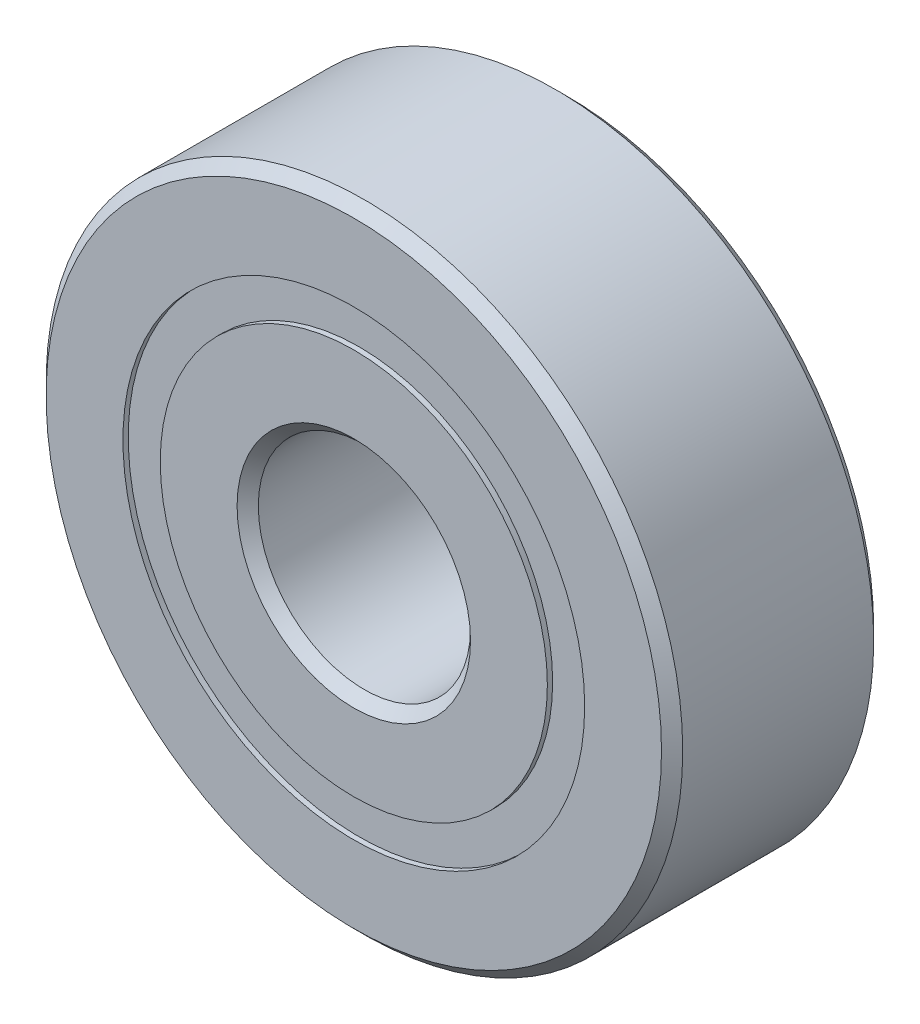
ISO-10303-21;
HEADER;
FILE_DESCRIPTION(('STEP AP214'),'2;1');
FILE_NAME('part.step','',(''),(''),'','','');
FILE_SCHEMA(('AUTOMOTIVE_DESIGN { 1 0 10303 214 1 1 1 1 }'));
ENDSEC;
DATA;
#1=APPLICATION_CONTEXT('core data for automotive mechanical design processes');
#2=APPLICATION_PROTOCOL_DEFINITION('international standard','automotive_design',2000,#1);
#3=PRODUCT_CONTEXT('',#1,'mechanical');
#4=PRODUCT('Part','Part','',(#3));
#5=PRODUCT_RELATED_PRODUCT_CATEGORY('part','',(#4));
#6=PRODUCT_DEFINITION_FORMATION('','',#4);
#7=PRODUCT_DEFINITION_CONTEXT('part definition',#1,'design');
#8=PRODUCT_DEFINITION('design','',#6,#7);
#9=PRODUCT_DEFINITION_SHAPE('','',#8);
#10=(LENGTH_UNIT() NAMED_UNIT(*) SI_UNIT(.MILLI.,.METRE.));
#11=(NAMED_UNIT(*) PLANE_ANGLE_UNIT() SI_UNIT($,.RADIAN.));
#12=(NAMED_UNIT(*) SI_UNIT($,.STERADIAN.) SOLID_ANGLE_UNIT());
#13=UNCERTAINTY_MEASURE_WITH_UNIT(LENGTH_MEASURE(1.E-05),#10,'distance_accuracy_value','');
#14=(GEOMETRIC_REPRESENTATION_CONTEXT(3) GLOBAL_UNCERTAINTY_ASSIGNED_CONTEXT((#13)) GLOBAL_UNIT_ASSIGNED_CONTEXT((#10,
#11,#12)) REPRESENTATION_CONTEXT('',''));
#15=CARTESIAN_POINT('',(0.,0.,0.));
#16=DIRECTION('',(0.,0.,1.));
#17=DIRECTION('',(1.,0.,0.));
#18=AXIS2_PLACEMENT_3D('',#15,#16,#17);
#19=CARTESIAN_POINT('',(0.,4.35164835164835,-1.9));
#20=DIRECTION('',(0.,0.,1.));
#21=DIRECTION('',(1.,0.,0.));
#22=AXIS2_PLACEMENT_3D('',#19,#20,#21);
#23=PLANE('',#22);
#24=CARTESIAN_POINT('',(0.,0.,-1.9));
#25=DIRECTION('',(0.,0.,1.));
#26=DIRECTION('',(1.,0.,0.));
#27=AXIS2_PLACEMENT_3D('',#24,#25,#26);
#28=CIRCLE('',#27,4.35164835164835);
#29=CARTESIAN_POINT('',(4.35164835164835,0.,-1.9));
#30=VERTEX_POINT('',#29);
#31=EDGE_CURVE('E57',#30,#30,#28,.T.);
#32=ORIENTED_EDGE('',*,*,#31,.F.);
#33=EDGE_LOOP('',(#32));
#34=FACE_BOUND('',#33,.T.);
#35=CARTESIAN_POINT('',(0.,0.,-1.9));
#36=DIRECTION('',(0.,0.,1.));
#37=DIRECTION('',(1.,0.,0.));
#38=AXIS2_PLACEMENT_3D('',#35,#36,#37);
#39=CIRCLE('',#38,3.64835164835165);
#40=CARTESIAN_POINT('',(3.64835164835165,0.,-1.9));
#41=VERTEX_POINT('',#40);
#42=EDGE_CURVE('E11',#41,#41,#39,.T.);
#43=ORIENTED_EDGE('',*,*,#42,.T.);
#44=EDGE_LOOP('',(#43));
#45=FACE_BOUND('',#44,.T.);
#46=ADVANCED_FACE('F43',(#34,#45),#23,.F.);
#47=CARTESIAN_POINT('',(0.,0.,2.));
#48=DIRECTION('',(0.,0.,1.));
#49=DIRECTION('',(1.,0.,0.));
#50=AXIS2_PLACEMENT_3D('',#47,#48,#49);
#51=CYLINDRICAL_SURFACE('',#50,3.64835164835165);
#52=ORIENTED_EDGE('',*,*,#42,.F.);
#53=EDGE_LOOP('',(#52));
#54=FACE_BOUND('',#53,.T.);
#55=CARTESIAN_POINT('',(0.,0.,-0.955918417024762));
#56=DIRECTION('',(0.,0.,1.));
#57=DIRECTION('',(1.,0.,0.));
#58=AXIS2_PLACEMENT_3D('',#55,#56,#57);
#59=CIRCLE('',#58,3.64835164835165);
#60=CARTESIAN_POINT('',(3.64835164835165,0.,-0.955918417024762));
#61=VERTEX_POINT('',#60);
#62=EDGE_CURVE('E49',#61,#61,#59,.T.);
#63=ORIENTED_EDGE('',*,*,#62,.T.);
#64=EDGE_LOOP('',(#63));
#65=FACE_BOUND('',#64,.T.);
#66=ADVANCED_FACE('F66',(#54,#65),#51,.F.);
#67=CARTESIAN_POINT('',(0.,4.35164835164835,-0.955918417024762));
#68=DIRECTION('',(0.,0.,-1.));
#69=DIRECTION('',(-1.,0.,0.));
#70=AXIS2_PLACEMENT_3D('',#67,#68,#69);
#71=PLANE('',#70);
#72=ORIENTED_EDGE('',*,*,#62,.F.);
#73=EDGE_LOOP('',(#72));
#74=FACE_BOUND('',#73,.T.);
#75=CARTESIAN_POINT('',(0.,0.,-0.955918417024762));
#76=DIRECTION('',(0.,0.,1.));
#77=DIRECTION('',(1.,0.,0.));
#78=AXIS2_PLACEMENT_3D('',#75,#76,#77);
#79=CIRCLE('',#78,4.35164835164835);
#80=CARTESIAN_POINT('',(4.35164835164835,0.,-0.955918417024762));
#81=VERTEX_POINT('',#80);
#82=EDGE_CURVE('E53',#81,#81,#79,.T.);
#83=ORIENTED_EDGE('',*,*,#82,.T.);
#84=EDGE_LOOP('',(#83));
#85=FACE_BOUND('',#84,.T.);
#86=ADVANCED_FACE('F70',(#74,#85),#71,.F.);
#87=CARTESIAN_POINT('',(0.,0.,2.));
#88=DIRECTION('',(0.,0.,1.));
#89=DIRECTION('',(1.,0.,0.));
#90=AXIS2_PLACEMENT_3D('',#87,#88,#89);
#91=CYLINDRICAL_SURFACE('',#90,4.35164835164835);
#92=ORIENTED_EDGE('',*,*,#82,.F.);
#93=EDGE_LOOP('',(#92));
#94=FACE_BOUND('',#93,.T.);
#95=ORIENTED_EDGE('',*,*,#31,.T.);
#96=EDGE_LOOP('',(#95));
#97=FACE_BOUND('',#96,.T.);
#98=ADVANCED_FACE('F63',(#94,#97),#91,.T.);
#99=CLOSED_SHELL('',(#46,#66,#86,#98));
#100=MANIFOLD_SOLID_BREP('B2',#99);
#101=CARTESIAN_POINT('',(0.,4.35164835164835,1.9));
#102=DIRECTION('',(0.,0.,-1.));
#103=DIRECTION('',(-1.,0.,0.));
#104=AXIS2_PLACEMENT_3D('',#101,#102,#103);
#105=PLANE('',#104);
#106=CARTESIAN_POINT('',(0.,0.,1.9));
#107=DIRECTION('',(0.,0.,1.));
#108=DIRECTION('',(1.,0.,0.));
#109=AXIS2_PLACEMENT_3D('',#106,#107,#108);
#110=CIRCLE('',#109,3.64835164835165);
#111=CARTESIAN_POINT('',(3.64835164835165,0.,1.9));
#112=VERTEX_POINT('',#111);
#113=EDGE_CURVE('E42',#112,#112,#110,.T.);
#114=ORIENTED_EDGE('',*,*,#113,.F.);
#115=EDGE_LOOP('',(#114));
#116=FACE_BOUND('',#115,.T.);
#117=CARTESIAN_POINT('',(0.,0.,1.9));
#118=DIRECTION('',(0.,0.,1.));
#119=DIRECTION('',(1.,0.,0.));
#120=AXIS2_PLACEMENT_3D('',#117,#118,#119);
#121=CIRCLE('',#120,4.35164835164835);
#122=CARTESIAN_POINT('',(4.35164835164835,0.,1.9));
#123=VERTEX_POINT('',#122);
#124=EDGE_CURVE('E124',#123,#123,#121,.T.);
#125=ORIENTED_EDGE('',*,*,#124,.T.);
#126=EDGE_LOOP('',(#125));
#127=FACE_BOUND('',#126,.T.);
#128=ADVANCED_FACE('F110',(#116,#127),#105,.F.);
#129=CARTESIAN_POINT('',(0.,0.,2.));
#130=DIRECTION('',(0.,0.,1.));
#131=DIRECTION('',(1.,0.,0.));
#132=AXIS2_PLACEMENT_3D('',#129,#130,#131);
#133=CYLINDRICAL_SURFACE('',#132,3.64835164835165);
#134=CARTESIAN_POINT('',(0.,0.,0.955918417024761));
#135=DIRECTION('',(0.,0.,1.));
#136=DIRECTION('',(1.,0.,0.));
#137=AXIS2_PLACEMENT_3D('',#134,#135,#136);
#138=CIRCLE('',#137,3.64835164835165);
#139=CARTESIAN_POINT('',(3.64835164835165,0.,0.955918417024761));
#140=VERTEX_POINT('',#139);
#141=EDGE_CURVE('E116',#140,#140,#138,.T.);
#142=ORIENTED_EDGE('',*,*,#141,.F.);
#143=EDGE_LOOP('',(#142));
#144=FACE_BOUND('',#143,.T.);
#145=ORIENTED_EDGE('',*,*,#113,.T.);
#146=EDGE_LOOP('',(#145));
#147=FACE_BOUND('',#146,.T.);
#148=ADVANCED_FACE('F139',(#144,#147),#133,.F.);
#149=CARTESIAN_POINT('',(0.,4.35164835164835,0.955918417024761));
#150=DIRECTION('',(0.,0.,1.));
#151=DIRECTION('',(1.,0.,0.));
#152=AXIS2_PLACEMENT_3D('',#149,#150,#151);
#153=PLANE('',#152);
#154=CARTESIAN_POINT('',(0.,0.,0.955918417024761));
#155=DIRECTION('',(0.,0.,1.));
#156=DIRECTION('',(1.,0.,0.));
#157=AXIS2_PLACEMENT_3D('',#154,#155,#156);
#158=CIRCLE('',#157,4.35164835164835);
#159=CARTESIAN_POINT('',(4.35164835164835,0.,0.955918417024761));
#160=VERTEX_POINT('',#159);
#161=EDGE_CURVE('E120',#160,#160,#158,.T.);
#162=ORIENTED_EDGE('',*,*,#161,.F.);
#163=EDGE_LOOP('',(#162));
#164=FACE_BOUND('',#163,.T.);
#165=ORIENTED_EDGE('',*,*,#141,.T.);
#166=EDGE_LOOP('',(#165));
#167=FACE_BOUND('',#166,.T.);
#168=ADVANCED_FACE('F134',(#164,#167),#153,.F.);
#169=CARTESIAN_POINT('',(0.,0.,2.));
#170=DIRECTION('',(0.,0.,1.));
#171=DIRECTION('',(1.,0.,0.));
#172=AXIS2_PLACEMENT_3D('',#169,#170,#171);
#173=CYLINDRICAL_SURFACE('',#172,4.35164835164835);
#174=ORIENTED_EDGE('',*,*,#124,.F.);
#175=EDGE_LOOP('',(#174));
#176=FACE_BOUND('',#175,.T.);
#177=ORIENTED_EDGE('',*,*,#161,.T.);
#178=EDGE_LOOP('',(#177));
#179=FACE_BOUND('',#178,.T.);
#180=ADVANCED_FACE('F131',(#176,#179),#173,.T.);
#181=CLOSED_SHELL('',(#128,#148,#168,#180));
#182=MANIFOLD_SOLID_BREP('B6',#181);
#183=CARTESIAN_POINT('',(-1.99999999999996,3.46410161513778,0.));
#184=DIRECTION('',(0.,0.,1.));
#185=DIRECTION('',(-0.499999999999989,0.866025403784445,0.));
#186=AXIS2_PLACEMENT_3D('',#183,#184,#185);
#187=SPHERICAL_SURFACE('',#186,0.955918417024761);
#188=CARTESIAN_POINT('',(-1.99999999999996,3.46410161513778,0.955918417024761));
#189=VERTEX_POINT('',#188);
#190=VERTEX_LOOP('',#189);
#191=FACE_BOUND('',#190,.T.);
#192=ADVANCED_FACE('F177',(#191),#187,.T.);
#193=CLOSED_SHELL('',(#192));
#194=MANIFOLD_SOLID_BREP('B37',#193);
#195=CARTESIAN_POINT('',(-3.46410161513773,2.00000000000004,0.));
#196=DIRECTION('',(0.,0.,1.));
#197=DIRECTION('',(-0.866025403784433,0.50000000000001,0.));
#198=AXIS2_PLACEMENT_3D('',#195,#196,#197);
#199=SPHERICAL_SURFACE('',#198,0.955918417024761);
#200=CARTESIAN_POINT('',(-3.46410161513773,2.00000000000004,0.955918417024761));
#201=VERTEX_POINT('',#200);
#202=VERTEX_LOOP('',#201);
#203=FACE_BOUND('',#202,.T.);
#204=ADVANCED_FACE('F198',(#203),#199,.T.);
#205=CLOSED_SHELL('',(#204));
#206=MANIFOLD_SOLID_BREP('B106',#205);
#207=CARTESIAN_POINT('',(-4.,0.,0.));
#208=DIRECTION('',(0.,0.,1.));
#209=DIRECTION('',(-1.,0.,0.));
#210=AXIS2_PLACEMENT_3D('',#207,#208,#209);
#211=SPHERICAL_SURFACE('',#210,0.955918417024761);
#212=CARTESIAN_POINT('',(-4.,0.,0.955918417024761));
#213=VERTEX_POINT('',#212);
#214=VERTEX_LOOP('',#213);
#215=FACE_BOUND('',#214,.T.);
#216=ADVANCED_FACE('F222',(#215),#211,.T.);
#217=CLOSED_SHELL('',(#216));
#218=MANIFOLD_SOLID_BREP('B173',#217);
#219=CARTESIAN_POINT('',(-3.46410161513777,-1.99999999999997,0.));
#220=DIRECTION('',(0.,0.,1.));
#221=DIRECTION('',(-0.866025403784443,-0.499999999999992,0.));
#222=AXIS2_PLACEMENT_3D('',#219,#220,#221);
#223=SPHERICAL_SURFACE('',#222,0.955918417024761);
#224=CARTESIAN_POINT('',(-3.46410161513777,-1.99999999999997,0.955918417024761));
#225=VERTEX_POINT('',#224);
#226=VERTEX_LOOP('',#225);
#227=FACE_BOUND('',#226,.T.);
#228=ADVANCED_FACE('F245',(#227),#223,.T.);
#229=CLOSED_SHELL('',(#228));
#230=MANIFOLD_SOLID_BREP('B194',#229);
#231=CARTESIAN_POINT('',(-2.00000000000003,-3.46410161513774,0.));
#232=DIRECTION('',(0.,0.,1.));
#233=DIRECTION('',(-0.500000000000007,-0.866025403784435,0.));
#234=AXIS2_PLACEMENT_3D('',#231,#232,#233);
#235=SPHERICAL_SURFACE('',#234,0.955918417024761);
#236=CARTESIAN_POINT('',(-2.00000000000003,-3.46410161513774,0.955918417024761));
#237=VERTEX_POINT('',#236);
#238=VERTEX_LOOP('',#237);
#239=FACE_BOUND('',#238,.T.);
#240=ADVANCED_FACE('F265',(#239),#235,.T.);
#241=CLOSED_SHELL('',(#240));
#242=MANIFOLD_SOLID_BREP('B218',#241);
#243=CARTESIAN_POINT('',(0.,-4.,0.));
#244=DIRECTION('',(0.,0.,1.));
#245=DIRECTION('',(0.,-1.,0.));
#246=AXIS2_PLACEMENT_3D('',#243,#244,#245);
#247=SPHERICAL_SURFACE('',#246,0.955918417024761);
#248=CARTESIAN_POINT('',(0.,-4.,0.955918417024761));
#249=VERTEX_POINT('',#248);
#250=VERTEX_LOOP('',#249);
#251=FACE_BOUND('',#250,.T.);
#252=ADVANCED_FACE('F286',(#251),#247,.T.);
#253=CLOSED_SHELL('',(#252));
#254=MANIFOLD_SOLID_BREP('B241',#253);
#255=CARTESIAN_POINT('',(1.99999999999998,-3.46410161513777,0.));
#256=DIRECTION('',(0.,0.,1.));
#257=DIRECTION('',(0.499999999999995,-0.866025403784442,0.));
#258=AXIS2_PLACEMENT_3D('',#255,#256,#257);
#259=SPHERICAL_SURFACE('',#258,0.955918417024761);
#260=CARTESIAN_POINT('',(1.99999999999998,-3.46410161513777,0.955918417024761));
#261=VERTEX_POINT('',#260);
#262=VERTEX_LOOP('',#261);
#263=FACE_BOUND('',#262,.T.);
#264=ADVANCED_FACE('F310',(#263),#259,.T.);
#265=CLOSED_SHELL('',(#264));
#266=MANIFOLD_SOLID_BREP('B261',#265);
#267=CARTESIAN_POINT('',(3.46410161513775,-2.00000000000002,0.));
#268=DIRECTION('',(0.,0.,1.));
#269=DIRECTION('',(0.866025403784436,-0.500000000000004,0.));
#270=AXIS2_PLACEMENT_3D('',#267,#268,#269);
#271=SPHERICAL_SURFACE('',#270,0.955918417024761);
#272=CARTESIAN_POINT('',(3.46410161513775,-2.00000000000002,0.955918417024761));
#273=VERTEX_POINT('',#272);
#274=VERTEX_LOOP('',#273);
#275=FACE_BOUND('',#274,.T.);
#276=ADVANCED_FACE('F333',(#275),#271,.T.);
#277=CLOSED_SHELL('',(#276));
#278=MANIFOLD_SOLID_BREP('B282',#277);
#279=CARTESIAN_POINT('',(4.,0.,0.));
#280=DIRECTION('',(0.,0.,1.));
#281=DIRECTION('',(1.,0.,0.));
#282=AXIS2_PLACEMENT_3D('',#279,#280,#281);
#283=SPHERICAL_SURFACE('',#282,0.955918417024761);
#284=CARTESIAN_POINT('',(4.,0.,0.955918417024761));
#285=VERTEX_POINT('',#284);
#286=VERTEX_LOOP('',#285);
#287=FACE_BOUND('',#286,.T.);
#288=ADVANCED_FACE('F353',(#287),#283,.T.);
#289=CLOSED_SHELL('',(#288));
#290=MANIFOLD_SOLID_BREP('B306',#289);
#291=CARTESIAN_POINT('',(3.46410161513776,1.99999999999999,0.));
#292=DIRECTION('',(0.,0.,1.));
#293=DIRECTION('',(0.86602540378444,0.499999999999998,0.));
#294=AXIS2_PLACEMENT_3D('',#291,#292,#293);
#295=SPHERICAL_SURFACE('',#294,0.955918417024761);
#296=CARTESIAN_POINT('',(3.46410161513776,1.99999999999999,0.955918417024761));
#297=VERTEX_POINT('',#296);
#298=VERTEX_LOOP('',#297);
#299=FACE_BOUND('',#298,.T.);
#300=ADVANCED_FACE('F373',(#299),#295,.T.);
#301=CLOSED_SHELL('',(#300));
#302=MANIFOLD_SOLID_BREP('B329',#301);
#303=CARTESIAN_POINT('',(2.,3.46410161513775,0.));
#304=DIRECTION('',(0.,0.,1.));
#305=DIRECTION('',(0.500000000000001,0.866025403784438,0.));
#306=AXIS2_PLACEMENT_3D('',#303,#304,#305);
#307=SPHERICAL_SURFACE('',#306,0.955918417024761);
#308=CARTESIAN_POINT('',(2.,3.46410161513775,0.955918417024761));
#309=VERTEX_POINT('',#308);
#310=VERTEX_LOOP('',#309);
#311=FACE_BOUND('',#310,.T.);
#312=ADVANCED_FACE('F393',(#311),#307,.T.);
#313=CLOSED_SHELL('',(#312));
#314=MANIFOLD_SOLID_BREP('B349',#313);
#315=CARTESIAN_POINT('',(0.,4.,0.));
#316=DIRECTION('',(0.,0.,1.));
#317=DIRECTION('',(0.,1.,0.));
#318=AXIS2_PLACEMENT_3D('',#315,#316,#317);
#319=SPHERICAL_SURFACE('',#318,0.955918417024761);
#320=CARTESIAN_POINT('',(0.,4.,0.955918417024761));
#321=VERTEX_POINT('',#320);
#322=VERTEX_LOOP('',#321);
#323=FACE_BOUND('',#322,.T.);
#324=ADVANCED_FACE('F416',(#323),#319,.T.);
#325=CLOSED_SHELL('',(#324));
#326=MANIFOLD_SOLID_BREP('B369',#325);
#327=CARTESIAN_POINT('',(0.,3.64835164835165,2.));
#328=DIRECTION('',(0.,0.,-1.));
#329=DIRECTION('',(-1.,0.,0.));
#330=AXIS2_PLACEMENT_3D('',#327,#328,#329);
#331=PLANE('',#330);
#332=CARTESIAN_POINT('',(0.,0.,2.));
#333=DIRECTION('',(0.,0.,1.));
#334=DIRECTION('',(1.,0.,0.));
#335=AXIS2_PLACEMENT_3D('',#332,#333,#334);
#336=CIRCLE('',#335,2.2);
#337=CARTESIAN_POINT('',(2.2,0.,2.));
#338=VERTEX_POINT('',#337);
#339=EDGE_CURVE('E467',#338,#338,#336,.T.);
#340=ORIENTED_EDGE('',*,*,#339,.F.);
#341=EDGE_LOOP('',(#340));
#342=FACE_BOUND('',#341,.T.);
#343=CARTESIAN_POINT('',(0.,0.,2.));
#344=DIRECTION('',(0.,0.,1.));
#345=DIRECTION('',(1.,0.,0.));
#346=AXIS2_PLACEMENT_3D('',#343,#344,#345);
#347=CIRCLE('',#346,3.64835164835165);
#348=CARTESIAN_POINT('',(3.64835164835165,0.,2.));
#349=VERTEX_POINT('',#348);
#350=EDGE_CURVE('E415',#349,#349,#347,.T.);
#351=ORIENTED_EDGE('',*,*,#350,.T.);
#352=EDGE_LOOP('',(#351));
#353=FACE_BOUND('',#352,.T.);
#354=ADVANCED_FACE('F439',(#342,#353),#331,.F.);
#355=CARTESIAN_POINT('',(0.,0.,2.));
#356=DIRECTION('',(0.,0.,1.));
#357=DIRECTION('',(1.,0.,0.));
#358=AXIS2_PLACEMENT_3D('',#355,#356,#357);
#359=CYLINDRICAL_SURFACE('',#358,3.64835164835165);
#360=ORIENTED_EDGE('',*,*,#350,.F.);
#361=EDGE_LOOP('',(#360));
#362=FACE_BOUND('',#361,.T.);
#363=CARTESIAN_POINT('',(0.,0.,0.888888888888889));
#364=DIRECTION('',(0.,0.,1.));
#365=DIRECTION('',(1.,0.,0.));
#366=AXIS2_PLACEMENT_3D('',#363,#364,#365);
#367=CIRCLE('',#366,3.64835164835165);
#368=CARTESIAN_POINT('',(3.64835164835165,0.,0.888888888888889));
#369=VERTEX_POINT('',#368);
#370=EDGE_CURVE('E445',#369,#369,#367,.T.);
#371=ORIENTED_EDGE('',*,*,#370,.T.);
#372=EDGE_LOOP('',(#371));
#373=FACE_BOUND('',#372,.T.);
#374=ADVANCED_FACE('F474',(#362,#373),#359,.T.);
#375=CARTESIAN_POINT('',(0.,0.,0.));
#376=DIRECTION('',(0.,0.,1.));
#377=DIRECTION('',(1.,0.,0.));
#378=AXIS2_PLACEMENT_3D('',#375,#376,#377);
#379=TOROIDAL_SURFACE('',#378,4.,0.95591841702476);
#380=ORIENTED_EDGE('',*,*,#370,.F.);
#381=EDGE_LOOP('',(#380));
#382=FACE_BOUND('',#381,.T.);
#383=CARTESIAN_POINT('',(0.,0.,-0.88888888888889));
#384=DIRECTION('',(0.,0.,1.));
#385=DIRECTION('',(1.,0.,0.));
#386=AXIS2_PLACEMENT_3D('',#383,#384,#385);
#387=CIRCLE('',#386,3.64835164835165);
#388=CARTESIAN_POINT('',(3.64835164835165,0.,-0.88888888888889));
#389=VERTEX_POINT('',#388);
#390=EDGE_CURVE('E449',#389,#389,#387,.T.);
#391=ORIENTED_EDGE('',*,*,#390,.T.);
#392=EDGE_LOOP('',(#391));
#393=FACE_BOUND('',#392,.T.);
#394=ADVANCED_FACE('F478',(#382,#393),#379,.F.);
#395=CARTESIAN_POINT('',(0.,0.,2.));
#396=DIRECTION('',(0.,0.,1.));
#397=DIRECTION('',(1.,0.,0.));
#398=AXIS2_PLACEMENT_3D('',#395,#396,#397);
#399=CYLINDRICAL_SURFACE('',#398,3.64835164835165);
#400=ORIENTED_EDGE('',*,*,#390,.F.);
#401=EDGE_LOOP('',(#400));
#402=FACE_BOUND('',#401,.T.);
#403=CARTESIAN_POINT('',(0.,0.,-2.));
#404=DIRECTION('',(0.,0.,1.));
#405=DIRECTION('',(1.,0.,0.));
#406=AXIS2_PLACEMENT_3D('',#403,#404,#405);
#407=CIRCLE('',#406,3.64835164835165);
#408=CARTESIAN_POINT('',(3.64835164835165,0.,-2.));
#409=VERTEX_POINT('',#408);
#410=EDGE_CURVE('E453',#409,#409,#407,.T.);
#411=ORIENTED_EDGE('',*,*,#410,.T.);
#412=EDGE_LOOP('',(#411));
#413=FACE_BOUND('',#412,.T.);
#414=ADVANCED_FACE('F483',(#402,#413),#399,.T.);
#415=CARTESIAN_POINT('',(0.,2.2,-2.));
#416=DIRECTION('',(0.,0.,1.));
#417=DIRECTION('',(1.,0.,0.));
#418=AXIS2_PLACEMENT_3D('',#415,#416,#417);
#419=PLANE('',#418);
#420=ORIENTED_EDGE('',*,*,#410,.F.);
#421=EDGE_LOOP('',(#420));
#422=FACE_BOUND('',#421,.T.);
#423=CARTESIAN_POINT('',(0.,0.,-2.));
#424=DIRECTION('',(0.,0.,1.));
#425=DIRECTION('',(1.,0.,0.));
#426=AXIS2_PLACEMENT_3D('',#423,#424,#425);
#427=CIRCLE('',#426,2.2);
#428=CARTESIAN_POINT('',(2.2,0.,-2.));
#429=VERTEX_POINT('',#428);
#430=EDGE_CURVE('E458',#429,#429,#427,.T.);
#431=ORIENTED_EDGE('',*,*,#430,.T.);
#432=EDGE_LOOP('',(#431));
#433=FACE_BOUND('',#432,.T.);
#434=ADVANCED_FACE('F489',(#422,#433),#419,.F.);
#435=CARTESIAN_POINT('',(0.,0.,-1.8));
#436=DIRECTION('',(0.,0.,-1.));
#437=DIRECTION('',(-1.,0.,0.));
#438=AXIS2_PLACEMENT_3D('',#435,#436,#437);
#439=CONICAL_SURFACE('',#438,2.,0.785398163397454);
#440=ORIENTED_EDGE('',*,*,#430,.F.);
#441=EDGE_LOOP('',(#440));
#442=FACE_BOUND('',#441,.T.);
#443=CARTESIAN_POINT('',(0.,0.,-1.8));
#444=DIRECTION('',(0.,0.,1.));
#445=DIRECTION('',(1.,0.,0.));
#446=AXIS2_PLACEMENT_3D('',#443,#444,#445);
#447=CIRCLE('',#446,2.);
#448=CARTESIAN_POINT('',(2.,0.,-1.8));
#449=VERTEX_POINT('',#448);
#450=EDGE_CURVE('E461',#449,#449,#447,.T.);
#451=ORIENTED_EDGE('',*,*,#450,.T.);
#452=EDGE_LOOP('',(#451));
#453=FACE_BOUND('',#452,.T.);
#454=ADVANCED_FACE('F493',(#442,#453),#439,.F.);
#455=CARTESIAN_POINT('',(0.,0.,2.));
#456=DIRECTION('',(0.,0.,1.));
#457=DIRECTION('',(1.,0.,0.));
#458=AXIS2_PLACEMENT_3D('',#455,#456,#457);
#459=CYLINDRICAL_SURFACE('',#458,2.);
#460=ORIENTED_EDGE('',*,*,#450,.F.);
#461=EDGE_LOOP('',(#460));
#462=FACE_BOUND('',#461,.T.);
#463=CARTESIAN_POINT('',(0.,0.,1.8));
#464=DIRECTION('',(0.,0.,1.));
#465=DIRECTION('',(1.,0.,0.));
#466=AXIS2_PLACEMENT_3D('',#463,#464,#465);
#467=CIRCLE('',#466,2.);
#468=CARTESIAN_POINT('',(2.,0.,1.8));
#469=VERTEX_POINT('',#468);
#470=EDGE_CURVE('E464',#469,#469,#467,.T.);
#471=ORIENTED_EDGE('',*,*,#470,.T.);
#472=EDGE_LOOP('',(#471));
#473=FACE_BOUND('',#472,.T.);
#474=ADVANCED_FACE('F497',(#462,#473),#459,.F.);
#475=CARTESIAN_POINT('',(0.,0.,2.));
#476=DIRECTION('',(0.,0.,1.));
#477=DIRECTION('',(1.,0.,0.));
#478=AXIS2_PLACEMENT_3D('',#475,#476,#477);
#479=CONICAL_SURFACE('',#478,2.2,0.785398163397442);
#480=ORIENTED_EDGE('',*,*,#470,.F.);
#481=EDGE_LOOP('',(#480));
#482=FACE_BOUND('',#481,.T.);
#483=ORIENTED_EDGE('',*,*,#339,.T.);
#484=EDGE_LOOP('',(#483));
#485=FACE_BOUND('',#484,.T.);
#486=ADVANCED_FACE('F471',(#482,#485),#479,.F.);
#487=CLOSED_SHELL('',(#354,#374,#394,#414,#434,#454,#474,#486));
#488=MANIFOLD_SOLID_BREP('B389',#487);
#489=CARTESIAN_POINT('',(0.,0.,1.8));
#490=DIRECTION('',(0.,0.,-1.));
#491=DIRECTION('',(-1.,0.,0.));
#492=AXIS2_PLACEMENT_3D('',#489,#490,#491);
#493=CONICAL_SURFACE('',#492,6.,0.78539816339745);
#494=CARTESIAN_POINT('',(0.,0.,2.));
#495=DIRECTION('',(0.,0.,1.));
#496=DIRECTION('',(1.,0.,0.));
#497=AXIS2_PLACEMENT_3D('',#494,#495,#496);
#498=CIRCLE('',#497,5.8);
#499=CARTESIAN_POINT('',(5.8,0.,2.));
#500=VERTEX_POINT('',#499);
#501=EDGE_CURVE('E591',#500,#500,#498,.T.);
#502=ORIENTED_EDGE('',*,*,#501,.F.);
#503=EDGE_LOOP('',(#502));
#504=FACE_BOUND('',#503,.T.);
#505=CARTESIAN_POINT('',(0.,0.,1.8));
#506=DIRECTION('',(0.,0.,1.));
#507=DIRECTION('',(1.,0.,0.));
#508=AXIS2_PLACEMENT_3D('',#505,#506,#507);
#509=CIRCLE('',#508,6.);
#510=CARTESIAN_POINT('',(6.,0.,1.8));
#511=VERTEX_POINT('',#510);
#512=EDGE_CURVE('E438',#511,#511,#509,.T.);
#513=ORIENTED_EDGE('',*,*,#512,.T.);
#514=EDGE_LOOP('',(#513));
#515=FACE_BOUND('',#514,.T.);
#516=ADVANCED_FACE('F563',(#504,#515),#493,.T.);
#517=CARTESIAN_POINT('',(0.,0.,2.));
#518=DIRECTION('',(0.,0.,1.));
#519=DIRECTION('',(1.,0.,0.));
#520=AXIS2_PLACEMENT_3D('',#517,#518,#519);
#521=CYLINDRICAL_SURFACE('',#520,6.);
#522=ORIENTED_EDGE('',*,*,#512,.F.);
#523=EDGE_LOOP('',(#522));
#524=FACE_BOUND('',#523,.T.);
#525=CARTESIAN_POINT('',(0.,0.,-1.8));
#526=DIRECTION('',(0.,0.,1.));
#527=DIRECTION('',(1.,0.,0.));
#528=AXIS2_PLACEMENT_3D('',#525,#526,#527);
#529=CIRCLE('',#528,6.);
#530=CARTESIAN_POINT('',(6.,0.,-1.8));
#531=VERTEX_POINT('',#530);
#532=EDGE_CURVE('E569',#531,#531,#529,.T.);
#533=ORIENTED_EDGE('',*,*,#532,.T.);
#534=EDGE_LOOP('',(#533));
#535=FACE_BOUND('',#534,.T.);
#536=ADVANCED_FACE('F598',(#524,#535),#521,.T.);
#537=CARTESIAN_POINT('',(0.,0.,-2.));
#538=DIRECTION('',(0.,0.,1.));
#539=DIRECTION('',(1.,0.,0.));
#540=AXIS2_PLACEMENT_3D('',#537,#538,#539);
#541=CONICAL_SURFACE('',#540,5.8,0.78539816339745);
#542=ORIENTED_EDGE('',*,*,#532,.F.);
#543=EDGE_LOOP('',(#542));
#544=FACE_BOUND('',#543,.T.);
#545=CARTESIAN_POINT('',(0.,0.,-2.));
#546=DIRECTION('',(0.,0.,1.));
#547=DIRECTION('',(1.,0.,0.));
#548=AXIS2_PLACEMENT_3D('',#545,#546,#547);
#549=CIRCLE('',#548,5.8);
#550=CARTESIAN_POINT('',(5.8,0.,-2.));
#551=VERTEX_POINT('',#550);
#552=EDGE_CURVE('E573',#551,#551,#549,.T.);
#553=ORIENTED_EDGE('',*,*,#552,.T.);
#554=EDGE_LOOP('',(#553));
#555=FACE_BOUND('',#554,.T.);
#556=ADVANCED_FACE('F602',(#544,#555),#541,.T.);
#557=CARTESIAN_POINT('',(0.,5.8,-2.));
#558=DIRECTION('',(0.,0.,1.));
#559=DIRECTION('',(1.,0.,0.));
#560=AXIS2_PLACEMENT_3D('',#557,#558,#559);
#561=PLANE('',#560);
#562=ORIENTED_EDGE('',*,*,#552,.F.);
#563=EDGE_LOOP('',(#562));
#564=FACE_BOUND('',#563,.T.);
#565=CARTESIAN_POINT('',(0.,0.,-2.));
#566=DIRECTION('',(0.,0.,1.));
#567=DIRECTION('',(1.,0.,0.));
#568=AXIS2_PLACEMENT_3D('',#565,#566,#567);
#569=CIRCLE('',#568,4.35164835164835);
#570=CARTESIAN_POINT('',(4.35164835164835,0.,-2.));
#571=VERTEX_POINT('',#570);
#572=EDGE_CURVE('E577',#571,#571,#569,.T.);
#573=ORIENTED_EDGE('',*,*,#572,.T.);
#574=EDGE_LOOP('',(#573));
#575=FACE_BOUND('',#574,.T.);
#576=ADVANCED_FACE('F607',(#564,#575),#561,.F.);
#577=CARTESIAN_POINT('',(0.,0.,2.));
#578=DIRECTION('',(0.,0.,1.));
#579=DIRECTION('',(1.,0.,0.));
#580=AXIS2_PLACEMENT_3D('',#577,#578,#579);
#581=CYLINDRICAL_SURFACE('',#580,4.35164835164835);
#582=ORIENTED_EDGE('',*,*,#572,.F.);
#583=EDGE_LOOP('',(#582));
#584=FACE_BOUND('',#583,.T.);
#585=CARTESIAN_POINT('',(0.,0.,-0.888888888888889));
#586=DIRECTION('',(0.,0.,1.));
#587=DIRECTION('',(1.,0.,0.));
#588=AXIS2_PLACEMENT_3D('',#585,#586,#587);
#589=CIRCLE('',#588,4.35164835164835);
#590=CARTESIAN_POINT('',(4.35164835164835,0.,-0.888888888888889));
#591=VERTEX_POINT('',#590);
#592=EDGE_CURVE('E582',#591,#591,#589,.T.);
#593=ORIENTED_EDGE('',*,*,#592,.T.);
#594=EDGE_LOOP('',(#593));
#595=FACE_BOUND('',#594,.T.);
#596=ADVANCED_FACE('F613',(#584,#595),#581,.F.);
#597=CARTESIAN_POINT('',(0.,0.,0.));
#598=DIRECTION('',(0.,0.,1.));
#599=DIRECTION('',(1.,0.,0.));
#600=AXIS2_PLACEMENT_3D('',#597,#598,#599);
#601=TOROIDAL_SURFACE('',#600,4.,0.955918417024761);
#602=ORIENTED_EDGE('',*,*,#592,.F.);
#603=EDGE_LOOP('',(#602));
#604=FACE_BOUND('',#603,.T.);
#605=CARTESIAN_POINT('',(0.,0.,0.888888888888889));
#606=DIRECTION('',(0.,0.,1.));
#607=DIRECTION('',(1.,0.,0.));
#608=AXIS2_PLACEMENT_3D('',#605,#606,#607);
#609=CIRCLE('',#608,4.35164835164835);
#610=CARTESIAN_POINT('',(4.35164835164835,0.,0.888888888888889));
#611=VERTEX_POINT('',#610);
#612=EDGE_CURVE('E585',#611,#611,#609,.T.);
#613=ORIENTED_EDGE('',*,*,#612,.T.);
#614=EDGE_LOOP('',(#613));
#615=FACE_BOUND('',#614,.T.);
#616=ADVANCED_FACE('F617',(#604,#615),#601,.F.);
#617=CARTESIAN_POINT('',(0.,0.,2.));
#618=DIRECTION('',(0.,0.,1.));
#619=DIRECTION('',(1.,0.,0.));
#620=AXIS2_PLACEMENT_3D('',#617,#618,#619);
#621=CYLINDRICAL_SURFACE('',#620,4.35164835164835);
#622=ORIENTED_EDGE('',*,*,#612,.F.);
#623=EDGE_LOOP('',(#622));
#624=FACE_BOUND('',#623,.T.);
#625=CARTESIAN_POINT('',(0.,0.,2.));
#626=DIRECTION('',(0.,0.,1.));
#627=DIRECTION('',(1.,0.,0.));
#628=AXIS2_PLACEMENT_3D('',#625,#626,#627);
#629=CIRCLE('',#628,4.35164835164835);
#630=CARTESIAN_POINT('',(4.35164835164835,0.,2.));
#631=VERTEX_POINT('',#630);
#632=EDGE_CURVE('E588',#631,#631,#629,.T.);
#633=ORIENTED_EDGE('',*,*,#632,.T.);
#634=EDGE_LOOP('',(#633));
#635=FACE_BOUND('',#634,.T.);
#636=ADVANCED_FACE('F621',(#624,#635),#621,.F.);
#637=CARTESIAN_POINT('',(0.,5.8,2.));
#638=DIRECTION('',(0.,0.,-1.));
#639=DIRECTION('',(-1.,0.,0.));
#640=AXIS2_PLACEMENT_3D('',#637,#638,#639);
#641=PLANE('',#640);
#642=ORIENTED_EDGE('',*,*,#632,.F.);
#643=EDGE_LOOP('',(#642));
#644=FACE_BOUND('',#643,.T.);
#645=ORIENTED_EDGE('',*,*,#501,.T.);
#646=EDGE_LOOP('',(#645));
#647=FACE_BOUND('',#646,.T.);
#648=ADVANCED_FACE('F595',(#644,#647),#641,.F.);
#649=CLOSED_SHELL('',(#516,#536,#556,#576,#596,#616,#636,#648));
#650=MANIFOLD_SOLID_BREP('B410',#649);
#651=ADVANCED_BREP_SHAPE_REPRESENTATION('',(#18,#100,#182,#194,#206,#218,#230,#242,#254,#266,
#278,#290,#302,#314,#326,#488,#650),#14);
#652=SHAPE_DEFINITION_REPRESENTATION(#9,#651);
ENDSEC;
END-ISO-10303-21;
